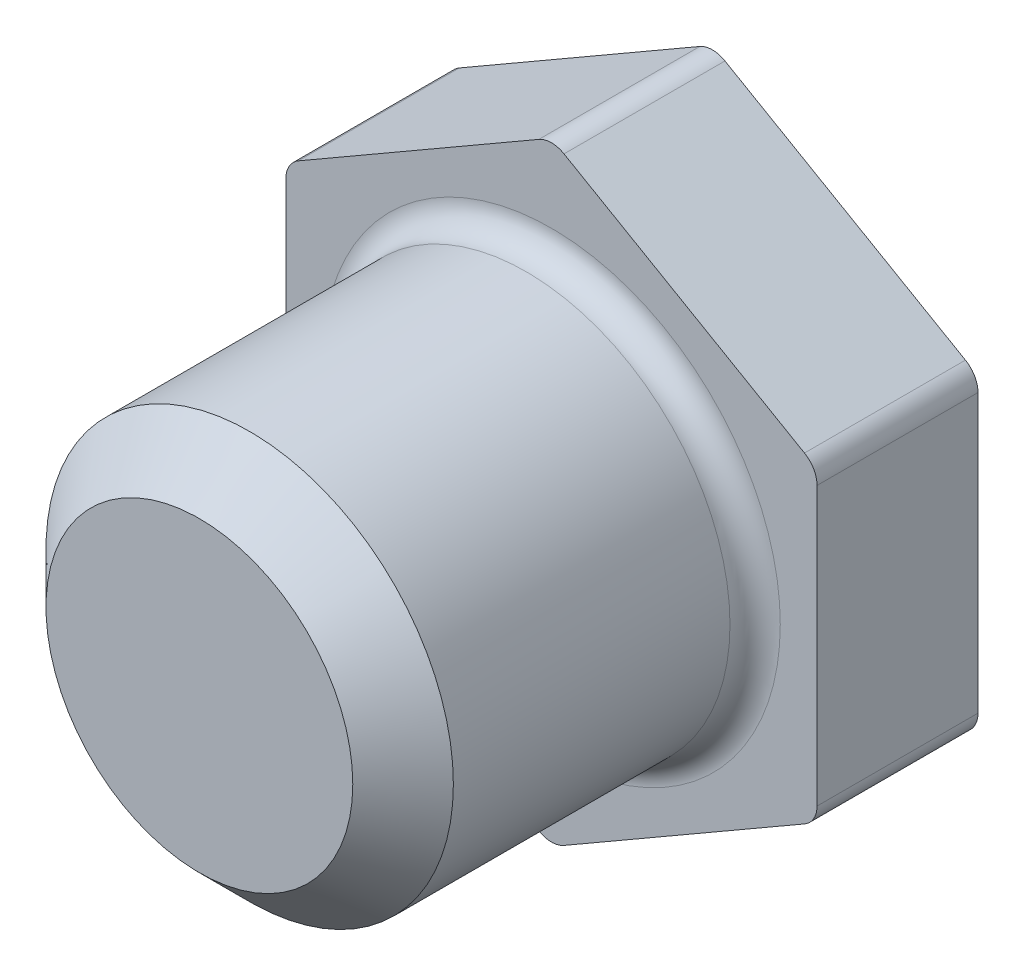
ISO-10303-21;
HEADER;
FILE_DESCRIPTION(('STEP AP214'),'2;1');
FILE_NAME('part.step','',(''),(''),'','','');
FILE_SCHEMA(('AUTOMOTIVE_DESIGN { 1 0 10303 214 1 1 1 1 }'));
ENDSEC;
DATA;
#1=APPLICATION_CONTEXT('core data for automotive mechanical design processes');
#2=APPLICATION_PROTOCOL_DEFINITION('international standard','automotive_design',2000,#1);
#3=PRODUCT_CONTEXT('',#1,'mechanical');
#4=PRODUCT('Part','Part','',(#3));
#5=PRODUCT_RELATED_PRODUCT_CATEGORY('part','',(#4));
#6=PRODUCT_DEFINITION_FORMATION('','',#4);
#7=PRODUCT_DEFINITION_CONTEXT('part definition',#1,'design');
#8=PRODUCT_DEFINITION('design','',#6,#7);
#9=PRODUCT_DEFINITION_SHAPE('','',#8);
#10=(LENGTH_UNIT() NAMED_UNIT(*) SI_UNIT(.MILLI.,.METRE.));
#11=(NAMED_UNIT(*) PLANE_ANGLE_UNIT() SI_UNIT($,.RADIAN.));
#12=(NAMED_UNIT(*) SI_UNIT($,.STERADIAN.) SOLID_ANGLE_UNIT());
#13=UNCERTAINTY_MEASURE_WITH_UNIT(LENGTH_MEASURE(1.E-05),#10,'distance_accuracy_value','');
#14=(GEOMETRIC_REPRESENTATION_CONTEXT(3) GLOBAL_UNCERTAINTY_ASSIGNED_CONTEXT((#13)) GLOBAL_UNIT_ASSIGNED_CONTEXT((#10,
#11,#12)) REPRESENTATION_CONTEXT('',''));
#15=CARTESIAN_POINT('',(0.,0.,0.));
#16=DIRECTION('',(0.,0.,1.));
#17=DIRECTION('',(1.,0.,0.));
#18=AXIS2_PLACEMENT_3D('',#15,#16,#17);
#19=CARTESIAN_POINT('',(5.28131212160006,-3.04916697508023,3.2));
#20=DIRECTION('',(-1.,0.,0.));
#21=DIRECTION('',(0.,-1.,0.));
#22=AXIS2_PLACEMENT_3D('',#19,#20,#21);
#23=PLANE('',#22);
#24=DIRECTION('',(0.,1.,0.));
#25=VECTOR('',#24,1.);
#26=CARTESIAN_POINT('',(5.28131212160006,-3.04916697508023,3.2));
#27=LINE('',#26,#25);
#28=CARTESIAN_POINT('',(5.28131212160006,-2.76049184048542,3.2));
#29=VERTEX_POINT('',#28);
#30=CARTESIAN_POINT('',(5.28131212160006,2.76049184048542,3.2));
#31=VERTEX_POINT('',#30);
#32=EDGE_CURVE('E145',#29,#31,#27,.T.);
#33=ORIENTED_EDGE('',*,*,#32,.F.);
#34=DIRECTION('',(0.,0.,-1.));
#35=VECTOR('',#34,1.);
#36=CARTESIAN_POINT('',(5.28131212160006,-2.76049184048542,3.2));
#37=LINE('',#36,#35);
#38=CARTESIAN_POINT('',(5.28131212160006,-2.76049184048542,0.));
#39=VERTEX_POINT('',#38);
#40=EDGE_CURVE('E159',#29,#39,#37,.T.);
#41=ORIENTED_EDGE('',*,*,#40,.T.);
#42=DIRECTION('',(0.,1.,0.));
#43=VECTOR('',#42,1.);
#44=CARTESIAN_POINT('',(5.28131212160006,-3.04916697508023,0.));
#45=LINE('',#44,#43);
#46=CARTESIAN_POINT('',(5.28131212160006,2.76049184048542,0.));
#47=VERTEX_POINT('',#46);
#48=EDGE_CURVE('E320',#39,#47,#45,.T.);
#49=ORIENTED_EDGE('',*,*,#48,.T.);
#50=DIRECTION('',(0.,0.,-1.));
#51=VECTOR('',#50,1.);
#52=CARTESIAN_POINT('',(5.28131212160006,2.76049184048542,3.2));
#53=LINE('',#52,#51);
#54=EDGE_CURVE('E161',#47,#31,#53,.F.);
#55=ORIENTED_EDGE('',*,*,#54,.T.);
#56=EDGE_LOOP('',(#33,#41,#49,#55));
#57=FACE_BOUND('',#56,.T.);
#58=ADVANCED_FACE('F47',(#57),#23,.F.);
#59=CARTESIAN_POINT('',(5.28131212160006,3.04916697508023,3.2));
#60=DIRECTION('',(-0.5,-0.866025403784439,0.));
#61=DIRECTION('',(0.866025403784439,-0.5,0.));
#62=AXIS2_PLACEMENT_3D('',#59,#60,#61);
#63=PLANE('',#62);
#64=DIRECTION('',(-0.866025403784439,0.5,0.));
#65=VECTOR('',#64,1.);
#66=CARTESIAN_POINT('',(5.28131212160006,3.04916697508023,3.2));
#67=LINE('',#66,#65);
#68=CARTESIAN_POINT('',(5.03131212160006,3.19350454237764,3.2));
#69=VERTEX_POINT('',#68);
#70=CARTESIAN_POINT('',(0.249999999999999,5.95399638286306,3.2));
#71=VERTEX_POINT('',#70);
#72=EDGE_CURVE('E163',#69,#71,#67,.T.);
#73=ORIENTED_EDGE('',*,*,#72,.F.);
#74=DIRECTION('',(0.,0.,-1.));
#75=VECTOR('',#74,1.);
#76=CARTESIAN_POINT('',(5.03131212160006,3.19350454237764,3.2));
#77=LINE('',#76,#75);
#78=CARTESIAN_POINT('',(5.03131212160006,3.19350454237764,0.));
#79=VERTEX_POINT('',#78);
#80=EDGE_CURVE('E173',#69,#79,#77,.T.);
#81=ORIENTED_EDGE('',*,*,#80,.T.);
#82=DIRECTION('',(-0.866025403784439,0.5,0.));
#83=VECTOR('',#82,1.);
#84=CARTESIAN_POINT('',(5.28131212160006,3.04916697508023,0.));
#85=LINE('',#84,#83);
#86=CARTESIAN_POINT('',(0.249999999999999,5.95399638286306,0.));
#87=VERTEX_POINT('',#86);
#88=EDGE_CURVE('E323',#79,#87,#85,.T.);
#89=ORIENTED_EDGE('',*,*,#88,.T.);
#90=DIRECTION('',(0.,0.,-1.));
#91=VECTOR('',#90,1.);
#92=CARTESIAN_POINT('',(0.249999999999999,5.95399638286306,3.2));
#93=LINE('',#92,#91);
#94=EDGE_CURVE('E169',#87,#71,#93,.F.);
#95=ORIENTED_EDGE('',*,*,#94,.T.);
#96=EDGE_LOOP('',(#73,#81,#89,#95));
#97=FACE_BOUND('',#96,.T.);
#98=ADVANCED_FACE('F197',(#97),#63,.F.);
#99=CARTESIAN_POINT('',(0.,6.09833395016046,3.2));
#100=DIRECTION('',(0.5,-0.866025403784439,0.));
#101=DIRECTION('',(0.866025403784439,0.5,0.));
#102=AXIS2_PLACEMENT_3D('',#99,#100,#101);
#103=PLANE('',#102);
#104=DIRECTION('',(-0.866025403784439,-0.5,0.));
#105=VECTOR('',#104,1.);
#106=CARTESIAN_POINT('',(0.,6.09833395016046,0.));
#107=LINE('',#106,#105);
#108=CARTESIAN_POINT('',(-0.250000000000001,5.95399638286306,0.));
#109=VERTEX_POINT('',#108);
#110=CARTESIAN_POINT('',(-5.03131212160006,3.19350454237764,0.));
#111=VERTEX_POINT('',#110);
#112=EDGE_CURVE('E326',#109,#111,#107,.T.);
#113=ORIENTED_EDGE('',*,*,#112,.T.);
#114=DIRECTION('',(0.,0.,-1.));
#115=VECTOR('',#114,1.);
#116=CARTESIAN_POINT('',(-5.03131212160006,3.19350454237764,3.2));
#117=LINE('',#116,#115);
#118=CARTESIAN_POINT('',(-5.03131212160006,3.19350454237764,3.2));
#119=VERTEX_POINT('',#118);
#120=EDGE_CURVE('E276',#111,#119,#117,.F.);
#121=ORIENTED_EDGE('',*,*,#120,.T.);
#122=DIRECTION('',(-0.866025403784439,-0.5,0.));
#123=VECTOR('',#122,1.);
#124=CARTESIAN_POINT('',(0.,6.09833395016046,3.2));
#125=LINE('',#124,#123);
#126=CARTESIAN_POINT('',(-0.250000000000001,5.95399638286306,3.2));
#127=VERTEX_POINT('',#126);
#128=EDGE_CURVE('E360',#127,#119,#125,.T.);
#129=ORIENTED_EDGE('',*,*,#128,.F.);
#130=DIRECTION('',(0.,0.,-1.));
#131=VECTOR('',#130,1.);
#132=CARTESIAN_POINT('',(-0.250000000000001,5.95399638286306,3.2));
#133=LINE('',#132,#131);
#134=EDGE_CURVE('E272',#127,#109,#133,.T.);
#135=ORIENTED_EDGE('',*,*,#134,.T.);
#136=EDGE_LOOP('',(#113,#121,#129,#135));
#137=FACE_BOUND('',#136,.T.);
#138=ADVANCED_FACE('F202',(#137),#103,.F.);
#139=CARTESIAN_POINT('',(-5.28131212160006,3.04916697508023,3.2));
#140=DIRECTION('',(1.,0.,0.));
#141=DIRECTION('',(0.,0.,-1.));
#142=AXIS2_PLACEMENT_3D('',#139,#140,#141);
#143=PLANE('',#142);
#144=DIRECTION('',(0.,-1.,0.));
#145=VECTOR('',#144,1.);
#146=CARTESIAN_POINT('',(-5.28131212160006,3.04916697508023,3.2));
#147=LINE('',#146,#145);
#148=CARTESIAN_POINT('',(-5.28131212160006,2.76049184048542,3.2));
#149=VERTEX_POINT('',#148);
#150=CARTESIAN_POINT('',(-5.28131212160006,-2.76049184048542,3.2));
#151=VERTEX_POINT('',#150);
#152=EDGE_CURVE('E316',#149,#151,#147,.T.);
#153=ORIENTED_EDGE('',*,*,#152,.F.);
#154=DIRECTION('',(0.,0.,-1.));
#155=VECTOR('',#154,1.);
#156=CARTESIAN_POINT('',(-5.28131212160006,2.76049184048542,3.2));
#157=LINE('',#156,#155);
#158=CARTESIAN_POINT('',(-5.28131212160006,2.76049184048542,0.));
#159=VERTEX_POINT('',#158);
#160=EDGE_CURVE('E253',#149,#159,#157,.T.);
#161=ORIENTED_EDGE('',*,*,#160,.T.);
#162=DIRECTION('',(0.,-1.,0.));
#163=VECTOR('',#162,1.);
#164=CARTESIAN_POINT('',(-5.28131212160006,3.04916697508023,0.));
#165=LINE('',#164,#163);
#166=CARTESIAN_POINT('',(-5.28131212160006,-2.76049184048542,0.));
#167=VERTEX_POINT('',#166);
#168=EDGE_CURVE('E304',#159,#167,#165,.T.);
#169=ORIENTED_EDGE('',*,*,#168,.T.);
#170=DIRECTION('',(0.,0.,-1.));
#171=VECTOR('',#170,1.);
#172=CARTESIAN_POINT('',(-5.28131212160006,-2.76049184048542,3.2));
#173=LINE('',#172,#171);
#174=EDGE_CURVE('E250',#167,#151,#173,.F.);
#175=ORIENTED_EDGE('',*,*,#174,.T.);
#176=EDGE_LOOP('',(#153,#161,#169,#175));
#177=FACE_BOUND('',#176,.T.);
#178=ADVANCED_FACE('F334',(#177),#143,.F.);
#179=CARTESIAN_POINT('',(-5.28131212160006,-3.04916697508023,3.2));
#180=DIRECTION('',(0.5,0.866025403784439,0.));
#181=DIRECTION('',(-0.866025403784439,0.5,0.));
#182=AXIS2_PLACEMENT_3D('',#179,#180,#181);
#183=PLANE('',#182);
#184=DIRECTION('',(0.866025403784439,-0.5,0.));
#185=VECTOR('',#184,1.);
#186=CARTESIAN_POINT('',(-5.28131212160006,-3.04916697508023,3.2));
#187=LINE('',#186,#185);
#188=CARTESIAN_POINT('',(-5.03131212160006,-3.19350454237764,3.2));
#189=VERTEX_POINT('',#188);
#190=CARTESIAN_POINT('',(-0.25,-5.95399638286305,3.2));
#191=VERTEX_POINT('',#190);
#192=EDGE_CURVE('E312',#189,#191,#187,.T.);
#193=ORIENTED_EDGE('',*,*,#192,.F.);
#194=DIRECTION('',(0.,0.,-1.));
#195=VECTOR('',#194,1.);
#196=CARTESIAN_POINT('',(-5.03131212160006,-3.19350454237764,3.2));
#197=LINE('',#196,#195);
#198=CARTESIAN_POINT('',(-5.03131212160006,-3.19350454237764,0.));
#199=VERTEX_POINT('',#198);
#200=EDGE_CURVE('E282',#189,#199,#197,.T.);
#201=ORIENTED_EDGE('',*,*,#200,.T.);
#202=DIRECTION('',(0.866025403784439,-0.5,0.));
#203=VECTOR('',#202,1.);
#204=CARTESIAN_POINT('',(-5.28131212160006,-3.04916697508023,0.));
#205=LINE('',#204,#203);
#206=CARTESIAN_POINT('',(-0.25,-5.95399638286305,0.));
#207=VERTEX_POINT('',#206);
#208=EDGE_CURVE('E301',#199,#207,#205,.T.);
#209=ORIENTED_EDGE('',*,*,#208,.T.);
#210=DIRECTION('',(0.,0.,-1.));
#211=VECTOR('',#210,1.);
#212=CARTESIAN_POINT('',(-0.25,-5.95399638286305,3.2));
#213=LINE('',#212,#211);
#214=EDGE_CURVE('E279',#207,#191,#213,.F.);
#215=ORIENTED_EDGE('',*,*,#214,.T.);
#216=EDGE_LOOP('',(#193,#201,#209,#215));
#217=FACE_BOUND('',#216,.T.);
#218=ADVANCED_FACE('F341',(#217),#183,.F.);
#219=CARTESIAN_POINT('',(0.,-6.09833395016046,3.2));
#220=DIRECTION('',(-0.5,0.866025403784439,0.));
#221=DIRECTION('',(-0.866025403784439,-0.5,0.));
#222=AXIS2_PLACEMENT_3D('',#219,#220,#221);
#223=PLANE('',#222);
#224=DIRECTION('',(0.866025403784439,0.5,0.));
#225=VECTOR('',#224,1.);
#226=CARTESIAN_POINT('',(0.,-6.09833395016046,3.2));
#227=LINE('',#226,#225);
#228=CARTESIAN_POINT('',(0.25,-5.95399638286305,3.2));
#229=VERTEX_POINT('',#228);
#230=CARTESIAN_POINT('',(5.03131212160006,-3.19350454237764,3.2));
#231=VERTEX_POINT('',#230);
#232=EDGE_CURVE('E148',#229,#231,#227,.T.);
#233=ORIENTED_EDGE('',*,*,#232,.F.);
#234=DIRECTION('',(0.,0.,-1.));
#235=VECTOR('',#234,1.);
#236=CARTESIAN_POINT('',(0.25,-5.95399638286305,3.2));
#237=LINE('',#236,#235);
#238=CARTESIAN_POINT('',(0.25,-5.95399638286305,0.));
#239=VERTEX_POINT('',#238);
#240=EDGE_CURVE('E175',#229,#239,#237,.T.);
#241=ORIENTED_EDGE('',*,*,#240,.T.);
#242=DIRECTION('',(0.866025403784439,0.5,0.));
#243=VECTOR('',#242,1.);
#244=CARTESIAN_POINT('',(0.,-6.09833395016046,0.));
#245=LINE('',#244,#243);
#246=CARTESIAN_POINT('',(5.03131212160006,-3.19350454237764,0.));
#247=VERTEX_POINT('',#246);
#248=EDGE_CURVE('E164',#239,#247,#245,.T.);
#249=ORIENTED_EDGE('',*,*,#248,.T.);
#250=DIRECTION('',(0.,0.,-1.));
#251=VECTOR('',#250,1.);
#252=CARTESIAN_POINT('',(5.03131212160006,-3.19350454237764,3.2));
#253=LINE('',#252,#251);
#254=EDGE_CURVE('E286',#247,#231,#253,.F.);
#255=ORIENTED_EDGE('',*,*,#254,.T.);
#256=EDGE_LOOP('',(#233,#241,#249,#255));
#257=FACE_BOUND('',#256,.T.);
#258=ADVANCED_FACE('F294',(#257),#223,.F.);
#259=CARTESIAN_POINT('',(0.,0.,3.2));
#260=DIRECTION('',(0.,0.,1.));
#261=DIRECTION('',(1.,0.,0.));
#262=AXIS2_PLACEMENT_3D('',#259,#260,#261);
#263=PLANE('',#262);
#264=CARTESIAN_POINT('',(0.,0.,3.2));
#265=DIRECTION('',(0.,0.,1.));
#266=DIRECTION('',(1.,0.,0.));
#267=AXIS2_PLACEMENT_3D('',#264,#265,#266);
#268=CIRCLE('',#267,4.55);
#269=CARTESIAN_POINT('',(4.55,0.,3.2));
#270=VERTEX_POINT('',#269);
#271=EDGE_CURVE('E246',#270,#270,#268,.F.);
#272=ORIENTED_EDGE('',*,*,#271,.T.);
#273=EDGE_LOOP('',(#272));
#274=FACE_BOUND('',#273,.T.);
#275=ORIENTED_EDGE('',*,*,#128,.T.);
#276=CARTESIAN_POINT('',(-4.78131212160006,2.76049184048542,3.2));
#277=DIRECTION('',(0.,0.,1.));
#278=DIRECTION('',(1.,0.,0.));
#279=AXIS2_PLACEMENT_3D('',#276,#277,#278);
#280=CIRCLE('',#279,0.5);
#281=EDGE_CURVE('E243',#119,#149,#280,.T.);
#282=ORIENTED_EDGE('',*,*,#281,.T.);
#283=ORIENTED_EDGE('',*,*,#152,.T.);
#284=CARTESIAN_POINT('',(-4.78131212160006,-2.76049184048542,3.2));
#285=DIRECTION('',(0.,0.,1.));
#286=DIRECTION('',(1.,0.,0.));
#287=AXIS2_PLACEMENT_3D('',#284,#285,#286);
#288=CIRCLE('',#287,0.5);
#289=EDGE_CURVE('E240',#151,#189,#288,.T.);
#290=ORIENTED_EDGE('',*,*,#289,.T.);
#291=ORIENTED_EDGE('',*,*,#192,.T.);
#292=CARTESIAN_POINT('',(0.,-5.52098368097083,3.2));
#293=DIRECTION('',(0.,0.,1.));
#294=DIRECTION('',(1.,0.,0.));
#295=AXIS2_PLACEMENT_3D('',#292,#293,#294);
#296=CIRCLE('',#295,0.5);
#297=EDGE_CURVE('E153',#191,#229,#296,.T.);
#298=ORIENTED_EDGE('',*,*,#297,.T.);
#299=ORIENTED_EDGE('',*,*,#232,.T.);
#300=CARTESIAN_POINT('',(4.78131212160006,-2.76049184048542,3.2));
#301=DIRECTION('',(0.,0.,1.));
#302=DIRECTION('',(1.,0.,0.));
#303=AXIS2_PLACEMENT_3D('',#300,#301,#302);
#304=CIRCLE('',#303,0.5);
#305=EDGE_CURVE('E141',#231,#29,#304,.T.);
#306=ORIENTED_EDGE('',*,*,#305,.T.);
#307=ORIENTED_EDGE('',*,*,#32,.T.);
#308=CARTESIAN_POINT('',(4.78131212160006,2.76049184048542,3.2));
#309=DIRECTION('',(0.,0.,1.));
#310=DIRECTION('',(1.,0.,0.));
#311=AXIS2_PLACEMENT_3D('',#308,#309,#310);
#312=CIRCLE('',#311,0.5);
#313=EDGE_CURVE('E154',#31,#69,#312,.T.);
#314=ORIENTED_EDGE('',*,*,#313,.T.);
#315=ORIENTED_EDGE('',*,*,#72,.T.);
#316=CARTESIAN_POINT('',(0.,5.52098368097084,3.2));
#317=DIRECTION('',(0.,0.,1.));
#318=DIRECTION('',(1.,0.,0.));
#319=AXIS2_PLACEMENT_3D('',#316,#317,#318);
#320=CIRCLE('',#319,0.5);
#321=EDGE_CURVE('E231',#71,#127,#320,.T.);
#322=ORIENTED_EDGE('',*,*,#321,.T.);
#323=EDGE_LOOP('',(#275,#282,#283,#290,#291,#298,#299,#306,#307,#314,#315,#322));
#324=FACE_BOUND('',#323,.T.);
#325=ADVANCED_FACE('F144',(#274,#324),#263,.T.);
#326=CARTESIAN_POINT('',(0.,0.,0.));
#327=DIRECTION('',(0.,0.,1.));
#328=DIRECTION('',(1.,0.,0.));
#329=AXIS2_PLACEMENT_3D('',#326,#327,#328);
#330=PLANE('',#329);
#331=ORIENTED_EDGE('',*,*,#168,.F.);
#332=CARTESIAN_POINT('',(-4.78131212160006,2.76049184048542,0.));
#333=DIRECTION('',(0.,0.,1.));
#334=DIRECTION('',(1.,0.,0.));
#335=AXIS2_PLACEMENT_3D('',#332,#333,#334);
#336=CIRCLE('',#335,0.5);
#337=EDGE_CURVE('E269',#159,#111,#336,.F.);
#338=ORIENTED_EDGE('',*,*,#337,.T.);
#339=ORIENTED_EDGE('',*,*,#112,.F.);
#340=CARTESIAN_POINT('',(0.,5.52098368097084,0.));
#341=DIRECTION('',(0.,0.,1.));
#342=DIRECTION('',(1.,0.,0.));
#343=AXIS2_PLACEMENT_3D('',#340,#341,#342);
#344=CIRCLE('',#343,0.5);
#345=EDGE_CURVE('E64',#109,#87,#344,.F.);
#346=ORIENTED_EDGE('',*,*,#345,.T.);
#347=ORIENTED_EDGE('',*,*,#88,.F.);
#348=CARTESIAN_POINT('',(4.78131212160006,2.76049184048542,0.));
#349=DIRECTION('',(0.,0.,1.));
#350=DIRECTION('',(1.,0.,0.));
#351=AXIS2_PLACEMENT_3D('',#348,#349,#350);
#352=CIRCLE('',#351,0.5);
#353=EDGE_CURVE('E72',#79,#47,#352,.F.);
#354=ORIENTED_EDGE('',*,*,#353,.T.);
#355=ORIENTED_EDGE('',*,*,#48,.F.);
#356=CARTESIAN_POINT('',(4.78131212160006,-2.76049184048542,0.));
#357=DIRECTION('',(0.,0.,1.));
#358=DIRECTION('',(1.,0.,0.));
#359=AXIS2_PLACEMENT_3D('',#356,#357,#358);
#360=CIRCLE('',#359,0.5);
#361=EDGE_CURVE('E167',#39,#247,#360,.F.);
#362=ORIENTED_EDGE('',*,*,#361,.T.);
#363=ORIENTED_EDGE('',*,*,#248,.F.);
#364=CARTESIAN_POINT('',(0.,-5.52098368097083,0.));
#365=DIRECTION('',(0.,0.,1.));
#366=DIRECTION('',(1.,0.,0.));
#367=AXIS2_PLACEMENT_3D('',#364,#365,#366);
#368=CIRCLE('',#367,0.5);
#369=EDGE_CURVE('E263',#239,#207,#368,.F.);
#370=ORIENTED_EDGE('',*,*,#369,.T.);
#371=ORIENTED_EDGE('',*,*,#208,.F.);
#372=CARTESIAN_POINT('',(-4.78131212160006,-2.76049184048542,0.));
#373=DIRECTION('',(0.,0.,1.));
#374=DIRECTION('',(1.,0.,0.));
#375=AXIS2_PLACEMENT_3D('',#372,#373,#374);
#376=CIRCLE('',#375,0.5);
#377=EDGE_CURVE('E266',#199,#167,#376,.F.);
#378=ORIENTED_EDGE('',*,*,#377,.T.);
#379=EDGE_LOOP('',(#331,#338,#339,#346,#347,#354,#355,#362,#363,#370,#371,#378));
#380=FACE_BOUND('',#379,.T.);
#381=ADVANCED_FACE('F297',(#380),#330,.F.);
#382=CARTESIAN_POINT('',(0.,0.,10.2));
#383=DIRECTION('',(0.,0.,-1.));
#384=DIRECTION('',(-1.,0.,0.));
#385=AXIS2_PLACEMENT_3D('',#382,#383,#384);
#386=CYLINDRICAL_SURFACE('',#385,4.05);
#387=CARTESIAN_POINT('',(0.,0.,9.2));
#388=DIRECTION('',(0.,0.,1.));
#389=DIRECTION('',(1.,0.,0.));
#390=AXIS2_PLACEMENT_3D('',#387,#388,#389);
#391=CIRCLE('',#390,4.05);
#392=CARTESIAN_POINT('',(4.05,0.,9.2));
#393=VERTEX_POINT('',#392);
#394=EDGE_CURVE('E11',#393,#393,#391,.F.);
#395=ORIENTED_EDGE('',*,*,#394,.T.);
#396=EDGE_LOOP('',(#395));
#397=FACE_BOUND('',#396,.T.);
#398=CARTESIAN_POINT('',(0.,0.,3.7));
#399=DIRECTION('',(0.,0.,1.));
#400=DIRECTION('',(1.,0.,0.));
#401=AXIS2_PLACEMENT_3D('',#398,#399,#400);
#402=CIRCLE('',#401,4.05);
#403=CARTESIAN_POINT('',(4.05,0.,3.7));
#404=VERTEX_POINT('',#403);
#405=EDGE_CURVE('E234',#404,#404,#402,.T.);
#406=ORIENTED_EDGE('',*,*,#405,.T.);
#407=EDGE_LOOP('',(#406));
#408=FACE_BOUND('',#407,.T.);
#409=ADVANCED_FACE('F404',(#397,#408),#386,.T.);
#410=CARTESIAN_POINT('',(0.,0.,10.2));
#411=DIRECTION('',(0.,0.,1.));
#412=DIRECTION('',(1.,0.,0.));
#413=AXIS2_PLACEMENT_3D('',#410,#411,#412);
#414=PLANE('',#413);
#415=CARTESIAN_POINT('',(0.,0.,10.2));
#416=DIRECTION('',(0.,0.,1.));
#417=DIRECTION('',(1.,0.,0.));
#418=AXIS2_PLACEMENT_3D('',#415,#416,#417);
#419=CIRCLE('',#418,3.05);
#420=CARTESIAN_POINT('',(3.05,0.,10.2));
#421=VERTEX_POINT('',#420);
#422=EDGE_CURVE('E57',#421,#421,#419,.T.);
#423=ORIENTED_EDGE('',*,*,#422,.T.);
#424=EDGE_LOOP('',(#423));
#425=FACE_BOUND('',#424,.T.);
#426=ADVANCED_FACE('F184',(#425),#414,.T.);
#427=CARTESIAN_POINT('',(0.,0.,3.7));
#428=DIRECTION('',(0.,0.,1.));
#429=DIRECTION('',(1.,0.,0.));
#430=AXIS2_PLACEMENT_3D('',#427,#428,#429);
#431=TOROIDAL_SURFACE('',#430,4.55,0.5);
#432=ORIENTED_EDGE('',*,*,#271,.F.);
#433=EDGE_LOOP('',(#432));
#434=FACE_BOUND('',#433,.T.);
#435=ORIENTED_EDGE('',*,*,#405,.F.);
#436=EDGE_LOOP('',(#435));
#437=FACE_BOUND('',#436,.T.);
#438=ADVANCED_FACE('F207',(#434,#437),#431,.F.);
#439=CARTESIAN_POINT('',(-4.78131212160006,2.76049184048542,3.2));
#440=DIRECTION('',(0.,0.,-1.));
#441=DIRECTION('',(-1.,0.,0.));
#442=AXIS2_PLACEMENT_3D('',#439,#440,#441);
#443=CYLINDRICAL_SURFACE('',#442,0.5);
#444=ORIENTED_EDGE('',*,*,#281,.F.);
#445=ORIENTED_EDGE('',*,*,#120,.F.);
#446=ORIENTED_EDGE('',*,*,#337,.F.);
#447=ORIENTED_EDGE('',*,*,#160,.F.);
#448=EDGE_LOOP('',(#444,#445,#446,#447));
#449=FACE_BOUND('',#448,.T.);
#450=ADVANCED_FACE('F210',(#449),#443,.T.);
#451=CARTESIAN_POINT('',(-4.78131212160006,-2.76049184048542,3.2));
#452=DIRECTION('',(0.,0.,-1.));
#453=DIRECTION('',(-1.,0.,0.));
#454=AXIS2_PLACEMENT_3D('',#451,#452,#453);
#455=CYLINDRICAL_SURFACE('',#454,0.5);
#456=ORIENTED_EDGE('',*,*,#289,.F.);
#457=ORIENTED_EDGE('',*,*,#174,.F.);
#458=ORIENTED_EDGE('',*,*,#377,.F.);
#459=ORIENTED_EDGE('',*,*,#200,.F.);
#460=EDGE_LOOP('',(#456,#457,#458,#459));
#461=FACE_BOUND('',#460,.T.);
#462=ADVANCED_FACE('F214',(#461),#455,.T.);
#463=CARTESIAN_POINT('',(0.,-5.52098368097083,3.2));
#464=DIRECTION('',(0.,0.,-1.));
#465=DIRECTION('',(-1.,0.,0.));
#466=AXIS2_PLACEMENT_3D('',#463,#464,#465);
#467=CYLINDRICAL_SURFACE('',#466,0.5);
#468=ORIENTED_EDGE('',*,*,#297,.F.);
#469=ORIENTED_EDGE('',*,*,#214,.F.);
#470=ORIENTED_EDGE('',*,*,#369,.F.);
#471=ORIENTED_EDGE('',*,*,#240,.F.);
#472=EDGE_LOOP('',(#468,#469,#470,#471));
#473=FACE_BOUND('',#472,.T.);
#474=ADVANCED_FACE('F218',(#473),#467,.T.);
#475=CARTESIAN_POINT('',(4.78131212160006,-2.76049184048542,3.2));
#476=DIRECTION('',(0.,0.,-1.));
#477=DIRECTION('',(-1.,0.,0.));
#478=AXIS2_PLACEMENT_3D('',#475,#476,#477);
#479=CYLINDRICAL_SURFACE('',#478,0.5);
#480=ORIENTED_EDGE('',*,*,#305,.F.);
#481=ORIENTED_EDGE('',*,*,#254,.F.);
#482=ORIENTED_EDGE('',*,*,#361,.F.);
#483=ORIENTED_EDGE('',*,*,#40,.F.);
#484=EDGE_LOOP('',(#480,#481,#482,#483));
#485=FACE_BOUND('',#484,.T.);
#486=ADVANCED_FACE('F166',(#485),#479,.T.);
#487=CARTESIAN_POINT('',(4.78131212160006,2.76049184048542,3.2));
#488=DIRECTION('',(0.,0.,-1.));
#489=DIRECTION('',(-1.,0.,0.));
#490=AXIS2_PLACEMENT_3D('',#487,#488,#489);
#491=CYLINDRICAL_SURFACE('',#490,0.5);
#492=ORIENTED_EDGE('',*,*,#313,.F.);
#493=ORIENTED_EDGE('',*,*,#54,.F.);
#494=ORIENTED_EDGE('',*,*,#353,.F.);
#495=ORIENTED_EDGE('',*,*,#80,.F.);
#496=EDGE_LOOP('',(#492,#493,#494,#495));
#497=FACE_BOUND('',#496,.T.);
#498=ADVANCED_FACE('F193',(#497),#491,.T.);
#499=CARTESIAN_POINT('',(0.,5.52098368097084,3.2));
#500=DIRECTION('',(0.,0.,-1.));
#501=DIRECTION('',(-1.,0.,0.));
#502=AXIS2_PLACEMENT_3D('',#499,#500,#501);
#503=CYLINDRICAL_SURFACE('',#502,0.5);
#504=ORIENTED_EDGE('',*,*,#321,.F.);
#505=ORIENTED_EDGE('',*,*,#94,.F.);
#506=ORIENTED_EDGE('',*,*,#345,.F.);
#507=ORIENTED_EDGE('',*,*,#134,.F.);
#508=EDGE_LOOP('',(#504,#505,#506,#507));
#509=FACE_BOUND('',#508,.T.);
#510=ADVANCED_FACE('F187',(#509),#503,.T.);
#511=CARTESIAN_POINT('',(0.,0.,10.2));
#512=DIRECTION('',(0.,0.,-1.));
#513=DIRECTION('',(-1.,0.,0.));
#514=AXIS2_PLACEMENT_3D('',#511,#512,#513);
#515=CONICAL_SURFACE('',#514,3.05,0.785398163397447);
#516=ORIENTED_EDGE('',*,*,#394,.F.);
#517=EDGE_LOOP('',(#516));
#518=FACE_BOUND('',#517,.T.);
#519=ORIENTED_EDGE('',*,*,#422,.F.);
#520=EDGE_LOOP('',(#519));
#521=FACE_BOUND('',#520,.T.);
#522=ADVANCED_FACE('F50',(#518,#521),#515,.T.);
#523=CLOSED_SHELL('',(#58,#98,#138,#178,#218,#258,#325,#381,#409,#426,#438,#450,#462,#474,#486,
#498,#510,#522));
#524=MANIFOLD_SOLID_BREP('B2',#523);
#525=ADVANCED_BREP_SHAPE_REPRESENTATION('',(#18,#524),#14);
#526=SHAPE_DEFINITION_REPRESENTATION(#9,#525);
ENDSEC;
END-ISO-10303-21;
